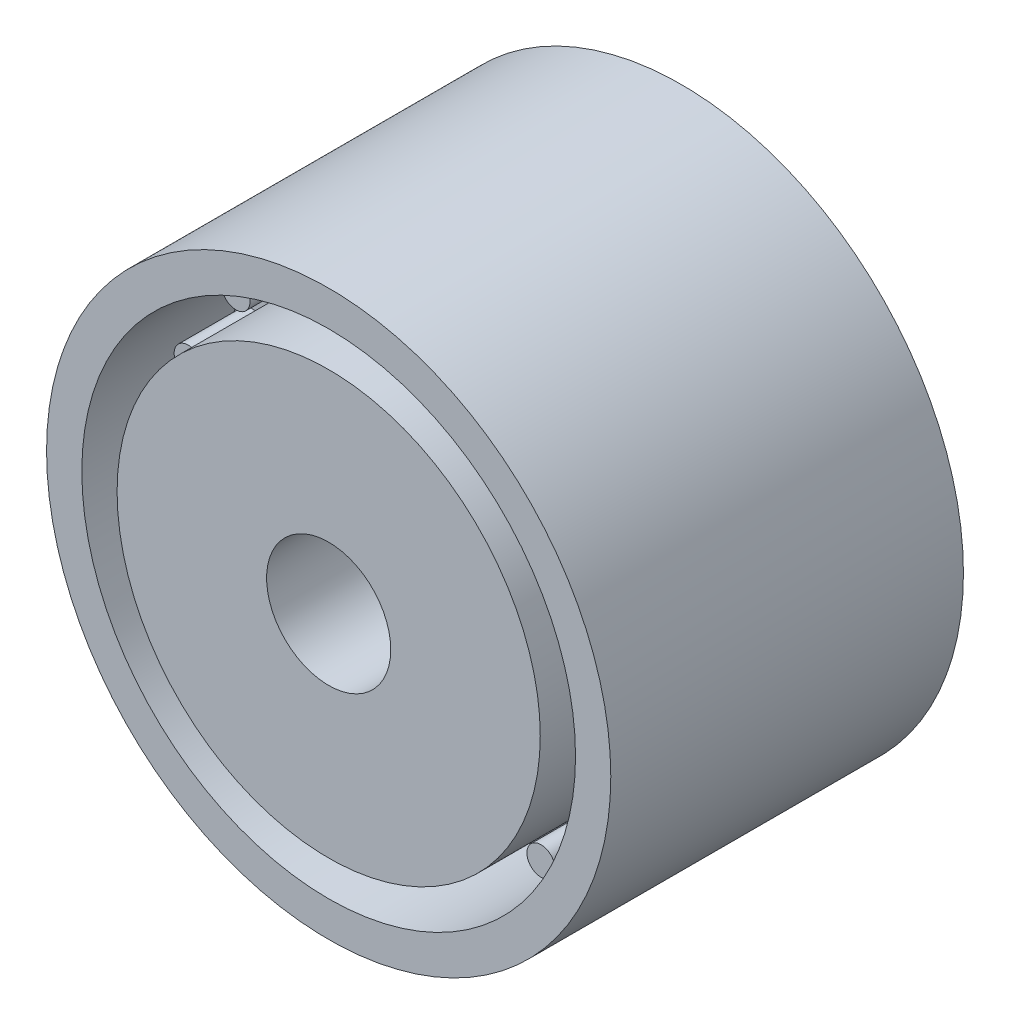
ISO-10303-21;
HEADER;
FILE_DESCRIPTION(('STEP AP214'),'2;1');
FILE_NAME('part.step','',(''),(''),'','','');
FILE_SCHEMA(('AUTOMOTIVE_DESIGN { 1 0 10303 214 1 1 1 1 }'));
ENDSEC;
DATA;
#1=APPLICATION_CONTEXT('core data for automotive mechanical design processes');
#2=APPLICATION_PROTOCOL_DEFINITION('international standard','automotive_design',2000,#1);
#3=PRODUCT_CONTEXT('',#1,'mechanical');
#4=PRODUCT('Part','Part','',(#3));
#5=PRODUCT_RELATED_PRODUCT_CATEGORY('part','',(#4));
#6=PRODUCT_DEFINITION_FORMATION('','',#4);
#7=PRODUCT_DEFINITION_CONTEXT('part definition',#1,'design');
#8=PRODUCT_DEFINITION('design','',#6,#7);
#9=PRODUCT_DEFINITION_SHAPE('','',#8);
#10=(LENGTH_UNIT() NAMED_UNIT(*) SI_UNIT(.MILLI.,.METRE.));
#11=(NAMED_UNIT(*) PLANE_ANGLE_UNIT() SI_UNIT($,.RADIAN.));
#12=(NAMED_UNIT(*) SI_UNIT($,.STERADIAN.) SOLID_ANGLE_UNIT());
#13=UNCERTAINTY_MEASURE_WITH_UNIT(LENGTH_MEASURE(1.E-05),#10,'distance_accuracy_value','');
#14=(GEOMETRIC_REPRESENTATION_CONTEXT(3) GLOBAL_UNCERTAINTY_ASSIGNED_CONTEXT((#13)) GLOBAL_UNIT_ASSIGNED_CONTEXT((#10,
#11,#12)) REPRESENTATION_CONTEXT('',''));
#15=CARTESIAN_POINT('',(0.,0.,0.));
#16=DIRECTION('',(0.,0.,1.));
#17=DIRECTION('',(1.,0.,0.));
#18=AXIS2_PLACEMENT_3D('',#15,#16,#17);
#19=CARTESIAN_POINT('',(0.,0.,-25.));
#20=DIRECTION('',(0.,0.,1.));
#21=DIRECTION('',(1.,0.,0.));
#22=AXIS2_PLACEMENT_3D('',#19,#20,#21);
#23=CYLINDRICAL_SURFACE('',#22,20.);
#24=CARTESIAN_POINT('',(0.,0.,-25.));
#25=DIRECTION('',(0.,0.,1.));
#26=DIRECTION('',(1.,0.,0.));
#27=AXIS2_PLACEMENT_3D('',#24,#25,#26);
#28=CIRCLE('',#27,20.);
#29=CARTESIAN_POINT('',(20.,0.,-25.));
#30=VERTEX_POINT('',#29);
#31=EDGE_CURVE('E10',#30,#30,#28,.T.);
#32=ORIENTED_EDGE('',*,*,#31,.T.);
#33=EDGE_LOOP('',(#32));
#34=FACE_BOUND('',#33,.T.);
#35=CARTESIAN_POINT('',(0.,0.,0.));
#36=DIRECTION('',(0.,0.,1.));
#37=DIRECTION('',(1.,0.,0.));
#38=AXIS2_PLACEMENT_3D('',#35,#36,#37);
#39=CIRCLE('',#38,20.);
#40=CARTESIAN_POINT('',(20.,0.,0.));
#41=VERTEX_POINT('',#40);
#42=EDGE_CURVE('E34',#41,#41,#39,.T.);
#43=ORIENTED_EDGE('',*,*,#42,.F.);
#44=EDGE_LOOP('',(#43));
#45=FACE_BOUND('',#44,.T.);
#46=ADVANCED_FACE('F31',(#34,#45),#23,.T.);
#47=CARTESIAN_POINT('',(0.,0.,-25.));
#48=DIRECTION('',(0.,0.,1.));
#49=DIRECTION('',(1.,0.,0.));
#50=AXIS2_PLACEMENT_3D('',#47,#48,#49);
#51=PLANE('',#50);
#52=CARTESIAN_POINT('',(0.,0.,-25.));
#53=DIRECTION('',(0.,0.,-1.));
#54=DIRECTION('',(-1.,0.,0.));
#55=AXIS2_PLACEMENT_3D('',#52,#53,#54);
#56=CIRCLE('',#55,12.5);
#57=CARTESIAN_POINT('',(-12.5,0.,-25.));
#58=VERTEX_POINT('',#57);
#59=EDGE_CURVE('E61',#58,#58,#56,.T.);
#60=ORIENTED_EDGE('',*,*,#59,.F.);
#61=EDGE_LOOP('',(#60));
#62=FACE_BOUND('',#61,.T.);
#63=ORIENTED_EDGE('',*,*,#31,.F.);
#64=EDGE_LOOP('',(#63));
#65=FACE_BOUND('',#64,.T.);
#66=ADVANCED_FACE('F212',(#62,#65),#51,.F.);
#67=CARTESIAN_POINT('',(0.,0.,0.));
#68=DIRECTION('',(0.,0.,1.));
#69=DIRECTION('',(1.,0.,0.));
#70=AXIS2_PLACEMENT_3D('',#67,#68,#69);
#71=PLANE('',#70);
#72=CARTESIAN_POINT('',(0.,0.,0.));
#73=DIRECTION('',(0.,0.,1.));
#74=DIRECTION('',(1.,0.,0.));
#75=AXIS2_PLACEMENT_3D('',#72,#73,#74);
#76=CIRCLE('',#75,17.5);
#77=CARTESIAN_POINT('',(17.5,0.,0.));
#78=VERTEX_POINT('',#77);
#79=EDGE_CURVE('E43',#78,#78,#76,.T.);
#80=ORIENTED_EDGE('',*,*,#79,.F.);
#81=EDGE_LOOP('',(#80));
#82=FACE_BOUND('',#81,.T.);
#83=ORIENTED_EDGE('',*,*,#42,.T.);
#84=EDGE_LOOP('',(#83));
#85=FACE_BOUND('',#84,.T.);
#86=ADVANCED_FACE('F206',(#82,#85),#71,.T.);
#87=CARTESIAN_POINT('',(0.,0.,-10.));
#88=DIRECTION('',(0.,0.,1.));
#89=DIRECTION('',(1.,0.,0.));
#90=AXIS2_PLACEMENT_3D('',#87,#88,#89);
#91=CYLINDRICAL_SURFACE('',#90,17.5);
#92=CARTESIAN_POINT('',(0.,0.,-10.));
#93=DIRECTION('',(0.,0.,1.));
#94=DIRECTION('',(1.,0.,0.));
#95=AXIS2_PLACEMENT_3D('',#92,#93,#94);
#96=CIRCLE('',#95,17.5);
#97=CARTESIAN_POINT('',(17.5,0.,-10.));
#98=VERTEX_POINT('',#97);
#99=EDGE_CURVE('E41',#98,#98,#96,.T.);
#100=ORIENTED_EDGE('',*,*,#99,.F.);
#101=EDGE_LOOP('',(#100));
#102=FACE_BOUND('',#101,.T.);
#103=ORIENTED_EDGE('',*,*,#79,.T.);
#104=EDGE_LOOP('',(#103));
#105=FACE_BOUND('',#104,.T.);
#106=ADVANCED_FACE('F170',(#102,#105),#91,.F.);
#107=CARTESIAN_POINT('',(0.,0.,-10.));
#108=DIRECTION('',(0.,0.,1.));
#109=DIRECTION('',(1.,0.,0.));
#110=AXIS2_PLACEMENT_3D('',#107,#108,#109);
#111=PLANE('',#110);
#112=CARTESIAN_POINT('',(-6.60947044998157,14.8451136866924,-10.));
#113=DIRECTION('',(0.,0.,1.));
#114=DIRECTION('',(1.,0.,0.));
#115=AXIS2_PLACEMENT_3D('',#112,#113,#114);
#116=CIRCLE('',#115,1.);
#117=CARTESIAN_POINT('',(-5.60947044998157,14.8451136866924,-10.));
#118=VERTEX_POINT('',#117);
#119=EDGE_CURVE('E151',#118,#118,#116,.T.);
#120=ORIENTED_EDGE('',*,*,#119,.F.);
#121=EDGE_LOOP('',(#120));
#122=FACE_BOUND('',#121,.T.);
#123=CARTESIAN_POINT('',(-12.0761034140075,10.8733723533316,-10.));
#124=DIRECTION('',(0.,0.,1.));
#125=DIRECTION('',(1.,0.,0.));
#126=AXIS2_PLACEMENT_3D('',#123,#124,#125);
#127=CIRCLE('',#126,1.);
#128=CARTESIAN_POINT('',(-11.0761034140075,10.8733723533316,-10.));
#129=VERTEX_POINT('',#128);
#130=EDGE_CURVE('E145',#129,#129,#127,.T.);
#131=ORIENTED_EDGE('',*,*,#130,.F.);
#132=EDGE_LOOP('',(#131));
#133=FACE_BOUND('',#132,.T.);
#134=CARTESIAN_POINT('',(-15.4546683897962,5.02152615859306,-10.));
#135=DIRECTION('',(0.,0.,1.));
#136=DIRECTION('',(1.,0.,0.));
#137=AXIS2_PLACEMENT_3D('',#134,#135,#136);
#138=CIRCLE('',#137,1.);
#139=CARTESIAN_POINT('',(-14.4546683897962,5.02152615859306,-10.));
#140=VERTEX_POINT('',#139);
#141=EDGE_CURVE('E139',#140,#140,#138,.T.);
#142=ORIENTED_EDGE('',*,*,#141,.F.);
#143=EDGE_LOOP('',(#142));
#144=FACE_BOUND('',#143,.T.);
#145=CARTESIAN_POINT('',(-16.1609807997345,-1.69858752809921,-10.));
#146=DIRECTION('',(0.,0.,1.));
#147=DIRECTION('',(1.,0.,0.));
#148=AXIS2_PLACEMENT_3D('',#145,#146,#147);
#149=CIRCLE('',#148,1.);
#150=CARTESIAN_POINT('',(-15.1609807997345,-1.69858752809921,-10.));
#151=VERTEX_POINT('',#150);
#152=EDGE_CURVE('E133',#151,#151,#149,.T.);
#153=ORIENTED_EDGE('',*,*,#152,.F.);
#154=EDGE_LOOP('',(#153));
#155=FACE_BOUND('',#154,.T.);
#156=CARTESIAN_POINT('',(-14.0729128114972,-8.12499999999987,-10.));
#157=DIRECTION('',(0.,0.,1.));
#158=DIRECTION('',(1.,0.,0.));
#159=AXIS2_PLACEMENT_3D('',#156,#157,#158);
#160=CIRCLE('',#159,1.);
#161=CARTESIAN_POINT('',(-13.0729128114972,-8.12499999999987,-10.));
#162=VERTEX_POINT('',#161);
#163=EDGE_CURVE('E127',#162,#162,#160,.T.);
#164=ORIENTED_EDGE('',*,*,#163,.F.);
#165=EDGE_LOOP('',(#164));
#166=FACE_BOUND('',#165,.T.);
#167=CARTESIAN_POINT('',(-9.5515103497528,-13.1465261585928,-10.));
#168=DIRECTION('',(0.,0.,1.));
#169=DIRECTION('',(1.,0.,0.));
#170=AXIS2_PLACEMENT_3D('',#167,#168,#169);
#171=CIRCLE('',#170,0.999999999999999);
#172=CARTESIAN_POINT('',(-8.5515103497528,-13.1465261585928,-10.));
#173=VERTEX_POINT('',#172);
#174=EDGE_CURVE('E121',#173,#173,#171,.T.);
#175=ORIENTED_EDGE('',*,*,#174,.F.);
#176=EDGE_LOOP('',(#175));
#177=FACE_BOUND('',#176,.T.);
#178=CARTESIAN_POINT('',(-3.37856497578871,-15.8948985119243,-10.));
#179=DIRECTION('',(0.,0.,1.));
#180=DIRECTION('',(1.,0.,0.));
#181=AXIS2_PLACEMENT_3D('',#178,#179,#180);
#182=CIRCLE('',#181,1.);
#183=CARTESIAN_POINT('',(-2.37856497578871,-15.8948985119243,-10.));
#184=VERTEX_POINT('',#183);
#185=EDGE_CURVE('E115',#184,#184,#182,.T.);
#186=ORIENTED_EDGE('',*,*,#185,.F.);
#187=EDGE_LOOP('',(#186));
#188=FACE_BOUND('',#187,.T.);
#189=CARTESIAN_POINT('',(3.37856497578849,-15.8948985119244,-10.));
#190=DIRECTION('',(0.,0.,1.));
#191=DIRECTION('',(1.,0.,0.));
#192=AXIS2_PLACEMENT_3D('',#189,#190,#191);
#193=CIRCLE('',#192,1.);
#194=CARTESIAN_POINT('',(4.37856497578849,-15.8948985119244,-10.));
#195=VERTEX_POINT('',#194);
#196=EDGE_CURVE('E109',#195,#195,#193,.T.);
#197=ORIENTED_EDGE('',*,*,#196,.F.);
#198=EDGE_LOOP('',(#197));
#199=FACE_BOUND('',#198,.T.);
#200=CARTESIAN_POINT('',(9.55151034975262,-13.1465261585929,-10.));
#201=DIRECTION('',(0.,0.,1.));
#202=DIRECTION('',(1.,0.,0.));
#203=AXIS2_PLACEMENT_3D('',#200,#201,#202);
#204=CIRCLE('',#203,1.);
#205=CARTESIAN_POINT('',(10.5515103497526,-13.1465261585929,-10.));
#206=VERTEX_POINT('',#205);
#207=EDGE_CURVE('E103',#206,#206,#204,.T.);
#208=ORIENTED_EDGE('',*,*,#207,.F.);
#209=EDGE_LOOP('',(#208));
#210=FACE_BOUND('',#209,.T.);
#211=CARTESIAN_POINT('',(14.0729128114971,-8.12500000000006,-10.));
#212=DIRECTION('',(0.,0.,1.));
#213=DIRECTION('',(1.,0.,0.));
#214=AXIS2_PLACEMENT_3D('',#211,#212,#213);
#215=CIRCLE('',#214,1.);
#216=CARTESIAN_POINT('',(15.0729128114971,-8.12500000000006,-10.));
#217=VERTEX_POINT('',#216);
#218=EDGE_CURVE('E97',#217,#217,#215,.T.);
#219=ORIENTED_EDGE('',*,*,#218,.F.);
#220=EDGE_LOOP('',(#219));
#221=FACE_BOUND('',#220,.T.);
#222=CARTESIAN_POINT('',(16.1609807997344,-1.69858752809943,-10.));
#223=DIRECTION('',(0.,0.,1.));
#224=DIRECTION('',(1.,0.,0.));
#225=AXIS2_PLACEMENT_3D('',#222,#223,#224);
#226=CIRCLE('',#225,1.);
#227=CARTESIAN_POINT('',(17.1609807997344,-1.69858752809943,-10.));
#228=VERTEX_POINT('',#227);
#229=EDGE_CURVE('E91',#228,#228,#226,.T.);
#230=ORIENTED_EDGE('',*,*,#229,.F.);
#231=EDGE_LOOP('',(#230));
#232=FACE_BOUND('',#231,.T.);
#233=CARTESIAN_POINT('',(15.4546683897963,5.02152615859286,-10.));
#234=DIRECTION('',(0.,0.,1.));
#235=DIRECTION('',(1.,0.,0.));
#236=AXIS2_PLACEMENT_3D('',#233,#234,#235);
#237=CIRCLE('',#236,1.);
#238=CARTESIAN_POINT('',(16.4546683897963,5.02152615859286,-10.));
#239=VERTEX_POINT('',#238);
#240=EDGE_CURVE('E85',#239,#239,#237,.T.);
#241=ORIENTED_EDGE('',*,*,#240,.F.);
#242=EDGE_LOOP('',(#241));
#243=FACE_BOUND('',#242,.T.);
#244=CARTESIAN_POINT('',(12.0761034140077,10.8733723533314,-10.));
#245=DIRECTION('',(0.,0.,1.));
#246=DIRECTION('',(1.,0.,0.));
#247=AXIS2_PLACEMENT_3D('',#244,#245,#246);
#248=CIRCLE('',#247,1.);
#249=CARTESIAN_POINT('',(13.0761034140077,10.8733723533314,-10.));
#250=VERTEX_POINT('',#249);
#251=EDGE_CURVE('E79',#250,#250,#248,.T.);
#252=ORIENTED_EDGE('',*,*,#251,.F.);
#253=EDGE_LOOP('',(#252));
#254=FACE_BOUND('',#253,.T.);
#255=CARTESIAN_POINT('',(6.60947044998177,14.8451136866923,-10.));
#256=DIRECTION('',(0.,0.,1.));
#257=DIRECTION('',(1.,0.,0.));
#258=AXIS2_PLACEMENT_3D('',#255,#256,#257);
#259=CIRCLE('',#258,1.);
#260=CARTESIAN_POINT('',(7.60947044998177,14.8451136866923,-10.));
#261=VERTEX_POINT('',#260);
#262=EDGE_CURVE('E73',#261,#261,#259,.T.);
#263=ORIENTED_EDGE('',*,*,#262,.F.);
#264=EDGE_LOOP('',(#263));
#265=FACE_BOUND('',#264,.T.);
#266=CARTESIAN_POINT('',(0.,16.25,-10.));
#267=DIRECTION('',(0.,0.,1.));
#268=DIRECTION('',(1.,0.,0.));
#269=AXIS2_PLACEMENT_3D('',#266,#267,#268);
#270=CIRCLE('',#269,1.);
#271=CARTESIAN_POINT('',(1.,16.25,-10.));
#272=VERTEX_POINT('',#271);
#273=EDGE_CURVE('E67',#272,#272,#270,.T.);
#274=ORIENTED_EDGE('',*,*,#273,.F.);
#275=EDGE_LOOP('',(#274));
#276=FACE_BOUND('',#275,.T.);
#277=CARTESIAN_POINT('',(0.,0.,-10.));
#278=DIRECTION('',(0.,0.,1.));
#279=DIRECTION('',(1.,0.,0.));
#280=AXIS2_PLACEMENT_3D('',#277,#278,#279);
#281=CIRCLE('',#280,15.);
#282=CARTESIAN_POINT('',(15.,0.,-10.));
#283=VERTEX_POINT('',#282);
#284=EDGE_CURVE('E46',#283,#283,#281,.T.);
#285=ORIENTED_EDGE('',*,*,#284,.F.);
#286=EDGE_LOOP('',(#285));
#287=FACE_BOUND('',#286,.T.);
#288=ORIENTED_EDGE('',*,*,#99,.T.);
#289=EDGE_LOOP('',(#288));
#290=FACE_BOUND('',#289,.T.);
#291=ADVANCED_FACE('F166',(#122,#133,#144,#155,#166,#177,#188,#199,#210,#221,#232,#243,#254,
#265,#276,#287,#290),#111,.T.);
#292=CARTESIAN_POINT('',(0.,0.,-10.));
#293=DIRECTION('',(0.,0.,1.));
#294=DIRECTION('',(1.,0.,0.));
#295=AXIS2_PLACEMENT_3D('',#292,#293,#294);
#296=CYLINDRICAL_SURFACE('',#295,15.);
#297=ORIENTED_EDGE('',*,*,#284,.T.);
#298=EDGE_LOOP('',(#297));
#299=FACE_BOUND('',#298,.T.);
#300=CARTESIAN_POINT('',(0.,0.,0.));
#301=DIRECTION('',(0.,0.,1.));
#302=DIRECTION('',(1.,0.,0.));
#303=AXIS2_PLACEMENT_3D('',#300,#301,#302);
#304=CIRCLE('',#303,15.);
#305=CARTESIAN_POINT('',(15.,0.,0.));
#306=VERTEX_POINT('',#305);
#307=EDGE_CURVE('E49',#306,#306,#304,.T.);
#308=ORIENTED_EDGE('',*,*,#307,.F.);
#309=EDGE_LOOP('',(#308));
#310=FACE_BOUND('',#309,.T.);
#311=ADVANCED_FACE('F169',(#299,#310),#296,.T.);
#312=CARTESIAN_POINT('',(0.,0.,0.));
#313=DIRECTION('',(0.,0.,1.));
#314=DIRECTION('',(1.,0.,0.));
#315=AXIS2_PLACEMENT_3D('',#312,#313,#314);
#316=CIRCLE('',#315,4.4);
#317=CARTESIAN_POINT('',(4.4,0.,0.));
#318=VERTEX_POINT('',#317);
#319=EDGE_CURVE('E55',#318,#318,#316,.T.);
#320=ORIENTED_EDGE('',*,*,#319,.F.);
#321=EDGE_LOOP('',(#320));
#322=FACE_BOUND('',#321,.T.);
#323=ORIENTED_EDGE('',*,*,#307,.T.);
#324=EDGE_LOOP('',(#323));
#325=FACE_BOUND('',#324,.T.);
#326=ADVANCED_FACE('F213',(#322,#325),#71,.T.);
#327=CARTESIAN_POINT('',(0.,0.,-7.));
#328=DIRECTION('',(0.,0.,1.));
#329=DIRECTION('',(1.,0.,0.));
#330=AXIS2_PLACEMENT_3D('',#327,#328,#329);
#331=CYLINDRICAL_SURFACE('',#330,4.4);
#332=CARTESIAN_POINT('',(0.,0.,-7.));
#333=DIRECTION('',(0.,0.,1.));
#334=DIRECTION('',(1.,0.,0.));
#335=AXIS2_PLACEMENT_3D('',#332,#333,#334);
#336=CIRCLE('',#335,4.4);
#337=CARTESIAN_POINT('',(4.4,0.,-7.));
#338=VERTEX_POINT('',#337);
#339=EDGE_CURVE('E52',#338,#338,#336,.T.);
#340=ORIENTED_EDGE('',*,*,#339,.F.);
#341=EDGE_LOOP('',(#340));
#342=FACE_BOUND('',#341,.T.);
#343=ORIENTED_EDGE('',*,*,#319,.T.);
#344=EDGE_LOOP('',(#343));
#345=FACE_BOUND('',#344,.T.);
#346=ADVANCED_FACE('F230',(#342,#345),#331,.F.);
#347=CARTESIAN_POINT('',(0.,0.,-7.));
#348=DIRECTION('',(0.,0.,1.));
#349=DIRECTION('',(1.,0.,0.));
#350=AXIS2_PLACEMENT_3D('',#347,#348,#349);
#351=PLANE('',#350);
#352=ORIENTED_EDGE('',*,*,#339,.T.);
#353=EDGE_LOOP('',(#352));
#354=FACE_BOUND('',#353,.T.);
#355=ADVANCED_FACE('F233',(#354),#351,.T.);
#356=CARTESIAN_POINT('',(0.,0.,-20.));
#357=DIRECTION('',(0.,0.,-1.));
#358=DIRECTION('',(-1.,0.,0.));
#359=AXIS2_PLACEMENT_3D('',#356,#357,#358);
#360=CYLINDRICAL_SURFACE('',#359,12.5);
#361=CARTESIAN_POINT('',(0.,0.,-20.));
#362=DIRECTION('',(0.,0.,-1.));
#363=DIRECTION('',(-1.,0.,0.));
#364=AXIS2_PLACEMENT_3D('',#361,#362,#363);
#365=CIRCLE('',#364,12.5);
#366=CARTESIAN_POINT('',(-12.5,0.,-20.));
#367=VERTEX_POINT('',#366);
#368=EDGE_CURVE('E58',#367,#367,#365,.T.);
#369=ORIENTED_EDGE('',*,*,#368,.F.);
#370=EDGE_LOOP('',(#369));
#371=FACE_BOUND('',#370,.T.);
#372=ORIENTED_EDGE('',*,*,#59,.T.);
#373=EDGE_LOOP('',(#372));
#374=FACE_BOUND('',#373,.T.);
#375=ADVANCED_FACE('F237',(#371,#374),#360,.F.);
#376=CARTESIAN_POINT('',(0.,0.,-20.));
#377=DIRECTION('',(0.,0.,-1.));
#378=DIRECTION('',(-1.,0.,0.));
#379=AXIS2_PLACEMENT_3D('',#376,#377,#378);
#380=PLANE('',#379);
#381=ORIENTED_EDGE('',*,*,#368,.T.);
#382=EDGE_LOOP('',(#381));
#383=FACE_BOUND('',#382,.T.);
#384=ADVANCED_FACE('F241',(#383),#380,.T.);
#385=CARTESIAN_POINT('',(0.,16.25,-5.5));
#386=DIRECTION('',(0.,0.,-1.));
#387=DIRECTION('',(-1.,0.,0.));
#388=AXIS2_PLACEMENT_3D('',#385,#386,#387);
#389=CYLINDRICAL_SURFACE('',#388,1.);
#390=CARTESIAN_POINT('',(0.,16.25,-5.5));
#391=DIRECTION('',(0.,0.,1.));
#392=DIRECTION('',(1.,0.,0.));
#393=AXIS2_PLACEMENT_3D('',#390,#391,#392);
#394=CIRCLE('',#393,1.);
#395=CARTESIAN_POINT('',(1.,16.25,-5.5));
#396=VERTEX_POINT('',#395);
#397=EDGE_CURVE('E64',#396,#396,#394,.T.);
#398=ORIENTED_EDGE('',*,*,#397,.F.);
#399=EDGE_LOOP('',(#398));
#400=FACE_BOUND('',#399,.T.);
#401=ORIENTED_EDGE('',*,*,#273,.T.);
#402=EDGE_LOOP('',(#401));
#403=FACE_BOUND('',#402,.T.);
#404=ADVANCED_FACE('F245',(#400,#403),#389,.T.);
#405=CARTESIAN_POINT('',(0.,16.25,-5.5));
#406=DIRECTION('',(0.,0.,1.));
#407=DIRECTION('',(1.,0.,0.));
#408=AXIS2_PLACEMENT_3D('',#405,#406,#407);
#409=PLANE('',#408);
#410=ORIENTED_EDGE('',*,*,#397,.T.);
#411=EDGE_LOOP('',(#410));
#412=FACE_BOUND('',#411,.T.);
#413=ADVANCED_FACE('F249',(#412),#409,.T.);
#414=CARTESIAN_POINT('',(6.60947044998177,14.8451136866923,-5.5));
#415=DIRECTION('',(0.,0.,-1.));
#416=DIRECTION('',(-1.,0.,0.));
#417=AXIS2_PLACEMENT_3D('',#414,#415,#416);
#418=CYLINDRICAL_SURFACE('',#417,1.);
#419=CARTESIAN_POINT('',(6.60947044998177,14.8451136866923,-5.5));
#420=DIRECTION('',(0.,0.,1.));
#421=DIRECTION('',(1.,0.,0.));
#422=AXIS2_PLACEMENT_3D('',#419,#420,#421);
#423=CIRCLE('',#422,1.);
#424=CARTESIAN_POINT('',(7.60947044998177,14.8451136866923,-5.5));
#425=VERTEX_POINT('',#424);
#426=EDGE_CURVE('E70',#425,#425,#423,.T.);
#427=ORIENTED_EDGE('',*,*,#426,.F.);
#428=EDGE_LOOP('',(#427));
#429=FACE_BOUND('',#428,.T.);
#430=ORIENTED_EDGE('',*,*,#262,.T.);
#431=EDGE_LOOP('',(#430));
#432=FACE_BOUND('',#431,.T.);
#433=ADVANCED_FACE('F253',(#429,#432),#418,.T.);
#434=CARTESIAN_POINT('',(6.60947044998177,14.8451136866923,-5.5));
#435=DIRECTION('',(0.,0.,1.));
#436=DIRECTION('',(1.,0.,0.));
#437=AXIS2_PLACEMENT_3D('',#434,#435,#436);
#438=PLANE('',#437);
#439=ORIENTED_EDGE('',*,*,#426,.T.);
#440=EDGE_LOOP('',(#439));
#441=FACE_BOUND('',#440,.T.);
#442=ADVANCED_FACE('F257',(#441),#438,.T.);
#443=CARTESIAN_POINT('',(12.0761034140077,10.8733723533314,-5.5));
#444=DIRECTION('',(0.,0.,-1.));
#445=DIRECTION('',(-1.,0.,0.));
#446=AXIS2_PLACEMENT_3D('',#443,#444,#445);
#447=CYLINDRICAL_SURFACE('',#446,1.);
#448=CARTESIAN_POINT('',(12.0761034140077,10.8733723533314,-5.5));
#449=DIRECTION('',(0.,0.,1.));
#450=DIRECTION('',(1.,0.,0.));
#451=AXIS2_PLACEMENT_3D('',#448,#449,#450);
#452=CIRCLE('',#451,1.);
#453=CARTESIAN_POINT('',(13.0761034140077,10.8733723533314,-5.5));
#454=VERTEX_POINT('',#453);
#455=EDGE_CURVE('E76',#454,#454,#452,.T.);
#456=ORIENTED_EDGE('',*,*,#455,.F.);
#457=EDGE_LOOP('',(#456));
#458=FACE_BOUND('',#457,.T.);
#459=ORIENTED_EDGE('',*,*,#251,.T.);
#460=EDGE_LOOP('',(#459));
#461=FACE_BOUND('',#460,.T.);
#462=ADVANCED_FACE('F261',(#458,#461),#447,.T.);
#463=CARTESIAN_POINT('',(12.0761034140077,10.8733723533314,-5.5));
#464=DIRECTION('',(0.,0.,1.));
#465=DIRECTION('',(1.,0.,0.));
#466=AXIS2_PLACEMENT_3D('',#463,#464,#465);
#467=PLANE('',#466);
#468=ORIENTED_EDGE('',*,*,#455,.T.);
#469=EDGE_LOOP('',(#468));
#470=FACE_BOUND('',#469,.T.);
#471=ADVANCED_FACE('F265',(#470),#467,.T.);
#472=CARTESIAN_POINT('',(15.4546683897963,5.02152615859286,-5.5));
#473=DIRECTION('',(0.,0.,-1.));
#474=DIRECTION('',(-1.,0.,0.));
#475=AXIS2_PLACEMENT_3D('',#472,#473,#474);
#476=CYLINDRICAL_SURFACE('',#475,1.);
#477=CARTESIAN_POINT('',(15.4546683897963,5.02152615859286,-5.5));
#478=DIRECTION('',(0.,0.,1.));
#479=DIRECTION('',(1.,0.,0.));
#480=AXIS2_PLACEMENT_3D('',#477,#478,#479);
#481=CIRCLE('',#480,1.);
#482=CARTESIAN_POINT('',(16.4546683897963,5.02152615859286,-5.5));
#483=VERTEX_POINT('',#482);
#484=EDGE_CURVE('E82',#483,#483,#481,.T.);
#485=ORIENTED_EDGE('',*,*,#484,.F.);
#486=EDGE_LOOP('',(#485));
#487=FACE_BOUND('',#486,.T.);
#488=ORIENTED_EDGE('',*,*,#240,.T.);
#489=EDGE_LOOP('',(#488));
#490=FACE_BOUND('',#489,.T.);
#491=ADVANCED_FACE('F269',(#487,#490),#476,.T.);
#492=CARTESIAN_POINT('',(15.4546683897963,5.02152615859286,-5.5));
#493=DIRECTION('',(0.,0.,1.));
#494=DIRECTION('',(1.,0.,0.));
#495=AXIS2_PLACEMENT_3D('',#492,#493,#494);
#496=PLANE('',#495);
#497=ORIENTED_EDGE('',*,*,#484,.T.);
#498=EDGE_LOOP('',(#497));
#499=FACE_BOUND('',#498,.T.);
#500=ADVANCED_FACE('F273',(#499),#496,.T.);
#501=CARTESIAN_POINT('',(16.1609807997344,-1.69858752809943,-5.5));
#502=DIRECTION('',(0.,0.,-1.));
#503=DIRECTION('',(-1.,0.,0.));
#504=AXIS2_PLACEMENT_3D('',#501,#502,#503);
#505=CYLINDRICAL_SURFACE('',#504,1.);
#506=CARTESIAN_POINT('',(16.1609807997344,-1.69858752809943,-5.5));
#507=DIRECTION('',(0.,0.,1.));
#508=DIRECTION('',(1.,0.,0.));
#509=AXIS2_PLACEMENT_3D('',#506,#507,#508);
#510=CIRCLE('',#509,1.);
#511=CARTESIAN_POINT('',(17.1609807997344,-1.69858752809943,-5.5));
#512=VERTEX_POINT('',#511);
#513=EDGE_CURVE('E88',#512,#512,#510,.T.);
#514=ORIENTED_EDGE('',*,*,#513,.F.);
#515=EDGE_LOOP('',(#514));
#516=FACE_BOUND('',#515,.T.);
#517=ORIENTED_EDGE('',*,*,#229,.T.);
#518=EDGE_LOOP('',(#517));
#519=FACE_BOUND('',#518,.T.);
#520=ADVANCED_FACE('F277',(#516,#519),#505,.T.);
#521=CARTESIAN_POINT('',(16.1609807997344,-1.69858752809943,-5.5));
#522=DIRECTION('',(0.,0.,1.));
#523=DIRECTION('',(1.,0.,0.));
#524=AXIS2_PLACEMENT_3D('',#521,#522,#523);
#525=PLANE('',#524);
#526=ORIENTED_EDGE('',*,*,#513,.T.);
#527=EDGE_LOOP('',(#526));
#528=FACE_BOUND('',#527,.T.);
#529=ADVANCED_FACE('F281',(#528),#525,.T.);
#530=CARTESIAN_POINT('',(14.0729128114971,-8.12500000000006,-5.5));
#531=DIRECTION('',(0.,0.,-1.));
#532=DIRECTION('',(-1.,0.,0.));
#533=AXIS2_PLACEMENT_3D('',#530,#531,#532);
#534=CYLINDRICAL_SURFACE('',#533,1.);
#535=CARTESIAN_POINT('',(14.0729128114971,-8.12500000000006,-5.5));
#536=DIRECTION('',(0.,0.,1.));
#537=DIRECTION('',(1.,0.,0.));
#538=AXIS2_PLACEMENT_3D('',#535,#536,#537);
#539=CIRCLE('',#538,1.);
#540=CARTESIAN_POINT('',(15.0729128114971,-8.12500000000006,-5.5));
#541=VERTEX_POINT('',#540);
#542=EDGE_CURVE('E94',#541,#541,#539,.T.);
#543=ORIENTED_EDGE('',*,*,#542,.F.);
#544=EDGE_LOOP('',(#543));
#545=FACE_BOUND('',#544,.T.);
#546=ORIENTED_EDGE('',*,*,#218,.T.);
#547=EDGE_LOOP('',(#546));
#548=FACE_BOUND('',#547,.T.);
#549=ADVANCED_FACE('F285',(#545,#548),#534,.T.);
#550=CARTESIAN_POINT('',(14.0729128114971,-8.12500000000006,-5.5));
#551=DIRECTION('',(0.,0.,1.));
#552=DIRECTION('',(1.,0.,0.));
#553=AXIS2_PLACEMENT_3D('',#550,#551,#552);
#554=PLANE('',#553);
#555=ORIENTED_EDGE('',*,*,#542,.T.);
#556=EDGE_LOOP('',(#555));
#557=FACE_BOUND('',#556,.T.);
#558=ADVANCED_FACE('F289',(#557),#554,.T.);
#559=CARTESIAN_POINT('',(9.55151034975262,-13.1465261585929,-5.5));
#560=DIRECTION('',(0.,0.,-1.));
#561=DIRECTION('',(-1.,0.,0.));
#562=AXIS2_PLACEMENT_3D('',#559,#560,#561);
#563=CYLINDRICAL_SURFACE('',#562,1.);
#564=CARTESIAN_POINT('',(9.55151034975262,-13.1465261585929,-5.5));
#565=DIRECTION('',(0.,0.,1.));
#566=DIRECTION('',(1.,0.,0.));
#567=AXIS2_PLACEMENT_3D('',#564,#565,#566);
#568=CIRCLE('',#567,1.);
#569=CARTESIAN_POINT('',(10.5515103497526,-13.1465261585929,-5.5));
#570=VERTEX_POINT('',#569);
#571=EDGE_CURVE('E100',#570,#570,#568,.T.);
#572=ORIENTED_EDGE('',*,*,#571,.F.);
#573=EDGE_LOOP('',(#572));
#574=FACE_BOUND('',#573,.T.);
#575=ORIENTED_EDGE('',*,*,#207,.T.);
#576=EDGE_LOOP('',(#575));
#577=FACE_BOUND('',#576,.T.);
#578=ADVANCED_FACE('F293',(#574,#577),#563,.T.);
#579=CARTESIAN_POINT('',(9.55151034975262,-13.1465261585929,-5.5));
#580=DIRECTION('',(0.,0.,1.));
#581=DIRECTION('',(1.,0.,0.));
#582=AXIS2_PLACEMENT_3D('',#579,#580,#581);
#583=PLANE('',#582);
#584=ORIENTED_EDGE('',*,*,#571,.T.);
#585=EDGE_LOOP('',(#584));
#586=FACE_BOUND('',#585,.T.);
#587=ADVANCED_FACE('F297',(#586),#583,.T.);
#588=CARTESIAN_POINT('',(3.37856497578849,-15.8948985119244,-5.5));
#589=DIRECTION('',(0.,0.,-1.));
#590=DIRECTION('',(-1.,0.,0.));
#591=AXIS2_PLACEMENT_3D('',#588,#589,#590);
#592=CYLINDRICAL_SURFACE('',#591,1.);
#593=CARTESIAN_POINT('',(3.37856497578849,-15.8948985119244,-5.5));
#594=DIRECTION('',(0.,0.,1.));
#595=DIRECTION('',(1.,0.,0.));
#596=AXIS2_PLACEMENT_3D('',#593,#594,#595);
#597=CIRCLE('',#596,1.);
#598=CARTESIAN_POINT('',(4.37856497578849,-15.8948985119244,-5.5));
#599=VERTEX_POINT('',#598);
#600=EDGE_CURVE('E106',#599,#599,#597,.T.);
#601=ORIENTED_EDGE('',*,*,#600,.F.);
#602=EDGE_LOOP('',(#601));
#603=FACE_BOUND('',#602,.T.);
#604=ORIENTED_EDGE('',*,*,#196,.T.);
#605=EDGE_LOOP('',(#604));
#606=FACE_BOUND('',#605,.T.);
#607=ADVANCED_FACE('F301',(#603,#606),#592,.T.);
#608=CARTESIAN_POINT('',(3.37856497578849,-15.8948985119244,-5.5));
#609=DIRECTION('',(0.,0.,1.));
#610=DIRECTION('',(1.,0.,0.));
#611=AXIS2_PLACEMENT_3D('',#608,#609,#610);
#612=PLANE('',#611);
#613=ORIENTED_EDGE('',*,*,#600,.T.);
#614=EDGE_LOOP('',(#613));
#615=FACE_BOUND('',#614,.T.);
#616=ADVANCED_FACE('F305',(#615),#612,.T.);
#617=CARTESIAN_POINT('',(-3.37856497578871,-15.8948985119243,-5.5));
#618=DIRECTION('',(0.,0.,-1.));
#619=DIRECTION('',(-1.,0.,0.));
#620=AXIS2_PLACEMENT_3D('',#617,#618,#619);
#621=CYLINDRICAL_SURFACE('',#620,1.);
#622=CARTESIAN_POINT('',(-3.37856497578871,-15.8948985119243,-5.5));
#623=DIRECTION('',(0.,0.,1.));
#624=DIRECTION('',(1.,0.,0.));
#625=AXIS2_PLACEMENT_3D('',#622,#623,#624);
#626=CIRCLE('',#625,1.);
#627=CARTESIAN_POINT('',(-2.37856497578871,-15.8948985119243,-5.5));
#628=VERTEX_POINT('',#627);
#629=EDGE_CURVE('E112',#628,#628,#626,.T.);
#630=ORIENTED_EDGE('',*,*,#629,.F.);
#631=EDGE_LOOP('',(#630));
#632=FACE_BOUND('',#631,.T.);
#633=ORIENTED_EDGE('',*,*,#185,.T.);
#634=EDGE_LOOP('',(#633));
#635=FACE_BOUND('',#634,.T.);
#636=ADVANCED_FACE('F309',(#632,#635),#621,.T.);
#637=CARTESIAN_POINT('',(-3.37856497578871,-15.8948985119243,-5.5));
#638=DIRECTION('',(0.,0.,1.));
#639=DIRECTION('',(1.,0.,0.));
#640=AXIS2_PLACEMENT_3D('',#637,#638,#639);
#641=PLANE('',#640);
#642=ORIENTED_EDGE('',*,*,#629,.T.);
#643=EDGE_LOOP('',(#642));
#644=FACE_BOUND('',#643,.T.);
#645=ADVANCED_FACE('F313',(#644),#641,.T.);
#646=CARTESIAN_POINT('',(-9.5515103497528,-13.1465261585928,-5.5));
#647=DIRECTION('',(0.,0.,-1.));
#648=DIRECTION('',(-1.,0.,0.));
#649=AXIS2_PLACEMENT_3D('',#646,#647,#648);
#650=CYLINDRICAL_SURFACE('',#649,0.999999999999999);
#651=CARTESIAN_POINT('',(-9.5515103497528,-13.1465261585928,-5.5));
#652=DIRECTION('',(0.,0.,1.));
#653=DIRECTION('',(1.,0.,0.));
#654=AXIS2_PLACEMENT_3D('',#651,#652,#653);
#655=CIRCLE('',#654,0.999999999999999);
#656=CARTESIAN_POINT('',(-8.5515103497528,-13.1465261585928,-5.5));
#657=VERTEX_POINT('',#656);
#658=EDGE_CURVE('E118',#657,#657,#655,.T.);
#659=ORIENTED_EDGE('',*,*,#658,.F.);
#660=EDGE_LOOP('',(#659));
#661=FACE_BOUND('',#660,.T.);
#662=ORIENTED_EDGE('',*,*,#174,.T.);
#663=EDGE_LOOP('',(#662));
#664=FACE_BOUND('',#663,.T.);
#665=ADVANCED_FACE('F317',(#661,#664),#650,.T.);
#666=CARTESIAN_POINT('',(-9.5515103497528,-13.1465261585928,-5.5));
#667=DIRECTION('',(0.,0.,1.));
#668=DIRECTION('',(1.,0.,0.));
#669=AXIS2_PLACEMENT_3D('',#666,#667,#668);
#670=PLANE('',#669);
#671=ORIENTED_EDGE('',*,*,#658,.T.);
#672=EDGE_LOOP('',(#671));
#673=FACE_BOUND('',#672,.T.);
#674=ADVANCED_FACE('F321',(#673),#670,.T.);
#675=CARTESIAN_POINT('',(-14.0729128114972,-8.12499999999987,-5.5));
#676=DIRECTION('',(0.,0.,-1.));
#677=DIRECTION('',(-1.,0.,0.));
#678=AXIS2_PLACEMENT_3D('',#675,#676,#677);
#679=CYLINDRICAL_SURFACE('',#678,1.);
#680=CARTESIAN_POINT('',(-14.0729128114972,-8.12499999999987,-5.5));
#681=DIRECTION('',(0.,0.,1.));
#682=DIRECTION('',(1.,0.,0.));
#683=AXIS2_PLACEMENT_3D('',#680,#681,#682);
#684=CIRCLE('',#683,1.);
#685=CARTESIAN_POINT('',(-13.0729128114972,-8.12499999999987,-5.5));
#686=VERTEX_POINT('',#685);
#687=EDGE_CURVE('E124',#686,#686,#684,.T.);
#688=ORIENTED_EDGE('',*,*,#687,.F.);
#689=EDGE_LOOP('',(#688));
#690=FACE_BOUND('',#689,.T.);
#691=ORIENTED_EDGE('',*,*,#163,.T.);
#692=EDGE_LOOP('',(#691));
#693=FACE_BOUND('',#692,.T.);
#694=ADVANCED_FACE('F325',(#690,#693),#679,.T.);
#695=CARTESIAN_POINT('',(-14.0729128114972,-8.12499999999987,-5.5));
#696=DIRECTION('',(0.,0.,1.));
#697=DIRECTION('',(1.,0.,0.));
#698=AXIS2_PLACEMENT_3D('',#695,#696,#697);
#699=PLANE('',#698);
#700=ORIENTED_EDGE('',*,*,#687,.T.);
#701=EDGE_LOOP('',(#700));
#702=FACE_BOUND('',#701,.T.);
#703=ADVANCED_FACE('F329',(#702),#699,.T.);
#704=CARTESIAN_POINT('',(-16.1609807997345,-1.69858752809921,-5.5));
#705=DIRECTION('',(0.,0.,-1.));
#706=DIRECTION('',(-1.,0.,0.));
#707=AXIS2_PLACEMENT_3D('',#704,#705,#706);
#708=CYLINDRICAL_SURFACE('',#707,1.);
#709=CARTESIAN_POINT('',(-16.1609807997345,-1.69858752809921,-5.5));
#710=DIRECTION('',(0.,0.,1.));
#711=DIRECTION('',(1.,0.,0.));
#712=AXIS2_PLACEMENT_3D('',#709,#710,#711);
#713=CIRCLE('',#712,1.);
#714=CARTESIAN_POINT('',(-15.1609807997345,-1.69858752809921,-5.5));
#715=VERTEX_POINT('',#714);
#716=EDGE_CURVE('E130',#715,#715,#713,.T.);
#717=ORIENTED_EDGE('',*,*,#716,.F.);
#718=EDGE_LOOP('',(#717));
#719=FACE_BOUND('',#718,.T.);
#720=ORIENTED_EDGE('',*,*,#152,.T.);
#721=EDGE_LOOP('',(#720));
#722=FACE_BOUND('',#721,.T.);
#723=ADVANCED_FACE('F333',(#719,#722),#708,.T.);
#724=CARTESIAN_POINT('',(-16.1609807997345,-1.69858752809921,-5.5));
#725=DIRECTION('',(0.,0.,1.));
#726=DIRECTION('',(1.,0.,0.));
#727=AXIS2_PLACEMENT_3D('',#724,#725,#726);
#728=PLANE('',#727);
#729=ORIENTED_EDGE('',*,*,#716,.T.);
#730=EDGE_LOOP('',(#729));
#731=FACE_BOUND('',#730,.T.);
#732=ADVANCED_FACE('F337',(#731),#728,.T.);
#733=CARTESIAN_POINT('',(-15.4546683897962,5.02152615859306,-5.5));
#734=DIRECTION('',(0.,0.,-1.));
#735=DIRECTION('',(-1.,0.,0.));
#736=AXIS2_PLACEMENT_3D('',#733,#734,#735);
#737=CYLINDRICAL_SURFACE('',#736,1.);
#738=CARTESIAN_POINT('',(-15.4546683897962,5.02152615859306,-5.5));
#739=DIRECTION('',(0.,0.,1.));
#740=DIRECTION('',(1.,0.,0.));
#741=AXIS2_PLACEMENT_3D('',#738,#739,#740);
#742=CIRCLE('',#741,1.);
#743=CARTESIAN_POINT('',(-14.4546683897962,5.02152615859306,-5.5));
#744=VERTEX_POINT('',#743);
#745=EDGE_CURVE('E136',#744,#744,#742,.T.);
#746=ORIENTED_EDGE('',*,*,#745,.F.);
#747=EDGE_LOOP('',(#746));
#748=FACE_BOUND('',#747,.T.);
#749=ORIENTED_EDGE('',*,*,#141,.T.);
#750=EDGE_LOOP('',(#749));
#751=FACE_BOUND('',#750,.T.);
#752=ADVANCED_FACE('F341',(#748,#751),#737,.T.);
#753=CARTESIAN_POINT('',(-15.4546683897962,5.02152615859306,-5.5));
#754=DIRECTION('',(0.,0.,1.));
#755=DIRECTION('',(1.,0.,0.));
#756=AXIS2_PLACEMENT_3D('',#753,#754,#755);
#757=PLANE('',#756);
#758=ORIENTED_EDGE('',*,*,#745,.T.);
#759=EDGE_LOOP('',(#758));
#760=FACE_BOUND('',#759,.T.);
#761=ADVANCED_FACE('F345',(#760),#757,.T.);
#762=CARTESIAN_POINT('',(-12.0761034140075,10.8733723533316,-5.5));
#763=DIRECTION('',(0.,0.,-1.));
#764=DIRECTION('',(-1.,0.,0.));
#765=AXIS2_PLACEMENT_3D('',#762,#763,#764);
#766=CYLINDRICAL_SURFACE('',#765,1.);
#767=CARTESIAN_POINT('',(-12.0761034140075,10.8733723533316,-5.5));
#768=DIRECTION('',(0.,0.,1.));
#769=DIRECTION('',(1.,0.,0.));
#770=AXIS2_PLACEMENT_3D('',#767,#768,#769);
#771=CIRCLE('',#770,1.);
#772=CARTESIAN_POINT('',(-11.0761034140075,10.8733723533316,-5.5));
#773=VERTEX_POINT('',#772);
#774=EDGE_CURVE('E142',#773,#773,#771,.T.);
#775=ORIENTED_EDGE('',*,*,#774,.F.);
#776=EDGE_LOOP('',(#775));
#777=FACE_BOUND('',#776,.T.);
#778=ORIENTED_EDGE('',*,*,#130,.T.);
#779=EDGE_LOOP('',(#778));
#780=FACE_BOUND('',#779,.T.);
#781=ADVANCED_FACE('F349',(#777,#780),#766,.T.);
#782=CARTESIAN_POINT('',(-12.0761034140075,10.8733723533316,-5.5));
#783=DIRECTION('',(0.,0.,1.));
#784=DIRECTION('',(1.,0.,0.));
#785=AXIS2_PLACEMENT_3D('',#782,#783,#784);
#786=PLANE('',#785);
#787=ORIENTED_EDGE('',*,*,#774,.T.);
#788=EDGE_LOOP('',(#787));
#789=FACE_BOUND('',#788,.T.);
#790=ADVANCED_FACE('F162',(#789),#786,.T.);
#791=CARTESIAN_POINT('',(-6.60947044998157,14.8451136866924,-5.5));
#792=DIRECTION('',(0.,0.,-1.));
#793=DIRECTION('',(-1.,0.,0.));
#794=AXIS2_PLACEMENT_3D('',#791,#792,#793);
#795=CYLINDRICAL_SURFACE('',#794,1.);
#796=CARTESIAN_POINT('',(-6.60947044998157,14.8451136866924,-5.5));
#797=DIRECTION('',(0.,0.,1.));
#798=DIRECTION('',(1.,0.,0.));
#799=AXIS2_PLACEMENT_3D('',#796,#797,#798);
#800=CIRCLE('',#799,1.);
#801=CARTESIAN_POINT('',(-5.60947044998157,14.8451136866924,-5.5));
#802=VERTEX_POINT('',#801);
#803=EDGE_CURVE('E148',#802,#802,#800,.T.);
#804=ORIENTED_EDGE('',*,*,#803,.F.);
#805=EDGE_LOOP('',(#804));
#806=FACE_BOUND('',#805,.T.);
#807=ORIENTED_EDGE('',*,*,#119,.T.);
#808=EDGE_LOOP('',(#807));
#809=FACE_BOUND('',#808,.T.);
#810=ADVANCED_FACE('F159',(#806,#809),#795,.T.);
#811=CARTESIAN_POINT('',(-6.60947044998157,14.8451136866924,-5.5));
#812=DIRECTION('',(0.,0.,1.));
#813=DIRECTION('',(1.,0.,0.));
#814=AXIS2_PLACEMENT_3D('',#811,#812,#813);
#815=PLANE('',#814);
#816=ORIENTED_EDGE('',*,*,#803,.T.);
#817=EDGE_LOOP('',(#816));
#818=FACE_BOUND('',#817,.T.);
#819=ADVANCED_FACE('F157',(#818),#815,.T.);
#820=CLOSED_SHELL('',(#46,#66,#86,#106,#291,#311,#326,#346,#355,#375,#384,#404,#413,#433,#442,
#462,#471,#491,#500,#520,#529,#549,#558,#578,#587,#607,#616,#636,#645,#665,#674,#694,#703,#723,
#732,#752,#761,#781,#790,#810,#819));
#821=MANIFOLD_SOLID_BREP('B2',#820);
#822=ADVANCED_BREP_SHAPE_REPRESENTATION('',(#18,#821),#14);
#823=SHAPE_DEFINITION_REPRESENTATION(#9,#822);
ENDSEC;
END-ISO-10303-21;
